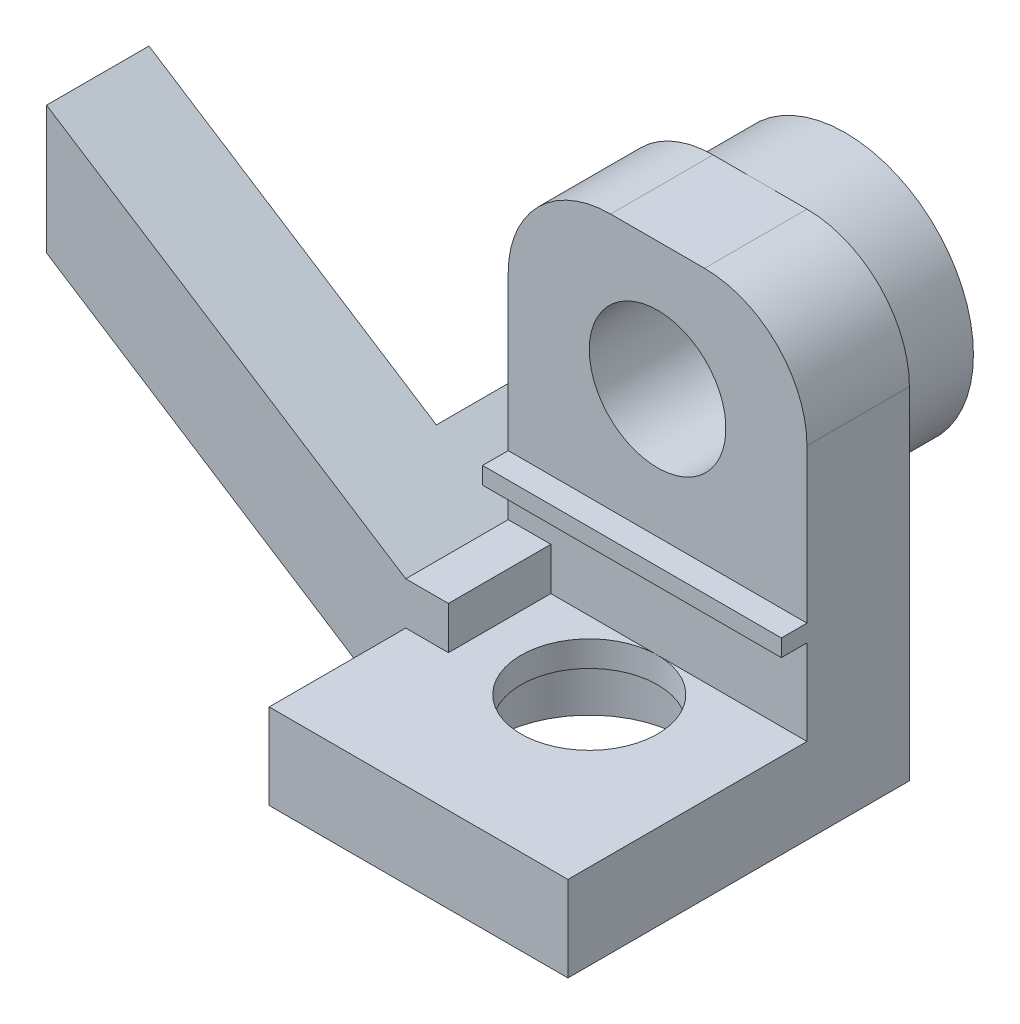
ISO-10303-21;
HEADER;
FILE_DESCRIPTION(('STEP AP214'),'2;1');
FILE_NAME('part.step','',(''),(''),'','','');
FILE_SCHEMA(('AUTOMOTIVE_DESIGN { 1 0 10303 214 1 1 1 1 }'));
ENDSEC;
DATA;
#1=APPLICATION_CONTEXT('core data for automotive mechanical design processes');
#2=APPLICATION_PROTOCOL_DEFINITION('international standard','automotive_design',2000,#1);
#3=PRODUCT_CONTEXT('',#1,'mechanical');
#4=PRODUCT('Part','Part','',(#3));
#5=PRODUCT_RELATED_PRODUCT_CATEGORY('part','',(#4));
#6=PRODUCT_DEFINITION_FORMATION('','',#4);
#7=PRODUCT_DEFINITION_CONTEXT('part definition',#1,'design');
#8=PRODUCT_DEFINITION('design','',#6,#7);
#9=PRODUCT_DEFINITION_SHAPE('','',#8);
#10=(LENGTH_UNIT() NAMED_UNIT(*) SI_UNIT(.MILLI.,.METRE.));
#11=(NAMED_UNIT(*) PLANE_ANGLE_UNIT() SI_UNIT($,.RADIAN.));
#12=(NAMED_UNIT(*) SI_UNIT($,.STERADIAN.) SOLID_ANGLE_UNIT());
#13=UNCERTAINTY_MEASURE_WITH_UNIT(LENGTH_MEASURE(1.E-05),#10,'distance_accuracy_value','');
#14=(GEOMETRIC_REPRESENTATION_CONTEXT(3) GLOBAL_UNCERTAINTY_ASSIGNED_CONTEXT((#13)) GLOBAL_UNIT_ASSIGNED_CONTEXT((#10,
#11,#12)) REPRESENTATION_CONTEXT('',''));
#15=CARTESIAN_POINT('',(0.,0.,0.));
#16=DIRECTION('',(0.,0.,1.));
#17=DIRECTION('',(1.,0.,0.));
#18=AXIS2_PLACEMENT_3D('',#15,#16,#17);
#19=CARTESIAN_POINT('',(-17.5,-12.,6.));
#20=DIRECTION('',(0.,0.,-1.));
#21=DIRECTION('',(-1.,0.,0.));
#22=AXIS2_PLACEMENT_3D('',#19,#20,#21);
#23=PLANE('',#22);
#24=DIRECTION('',(-1.,0.,0.));
#25=VECTOR('',#24,1.);
#26=CARTESIAN_POINT('',(-12.5,-7.,6.));
#27=LINE('',#26,#25);
#28=CARTESIAN_POINT('',(-12.5,-7.,6.));
#29=VERTEX_POINT('',#28);
#30=CARTESIAN_POINT('',(-17.5,-7.,6.));
#31=VERTEX_POINT('',#30);
#32=EDGE_CURVE('E206',#29,#31,#27,.T.);
#33=ORIENTED_EDGE('',*,*,#32,.F.);
#34=DIRECTION('',(0.,1.,0.));
#35=VECTOR('',#34,1.);
#36=CARTESIAN_POINT('',(-12.5,-7.,6.));
#37=LINE('',#36,#35);
#38=CARTESIAN_POINT('',(-12.5,-12.,6.));
#39=VERTEX_POINT('',#38);
#40=EDGE_CURVE('E213',#39,#29,#37,.T.);
#41=ORIENTED_EDGE('',*,*,#40,.F.);
#42=DIRECTION('',(-1.,0.,0.));
#43=VECTOR('',#42,1.);
#44=CARTESIAN_POINT('',(-17.5,-12.,6.));
#45=LINE('',#44,#43);
#46=CARTESIAN_POINT('',(0.,-12.,6.));
#47=VERTEX_POINT('',#46);
#48=EDGE_CURVE('E211',#47,#39,#45,.T.);
#49=ORIENTED_EDGE('',*,*,#48,.F.);
#50=CARTESIAN_POINT('',(17.5,-12.,6.));
#51=VERTEX_POINT('',#50);
#52=EDGE_CURVE('E331',#51,#47,#45,.T.);
#53=ORIENTED_EDGE('',*,*,#52,.F.);
#54=DIRECTION('',(0.,1.,0.));
#55=VECTOR('',#54,1.);
#56=CARTESIAN_POINT('',(17.5,-12.,6.));
#57=LINE('',#56,#55);
#58=CARTESIAN_POINT('',(17.5,-2.,6.));
#59=VERTEX_POINT('',#58);
#60=EDGE_CURVE('E340',#51,#59,#57,.T.);
#61=ORIENTED_EDGE('',*,*,#60,.T.);
#62=DIRECTION('',(-1.,0.,0.));
#63=VECTOR('',#62,1.);
#64=CARTESIAN_POINT('',(-17.5,-2.,6.));
#65=LINE('',#64,#63);
#66=CARTESIAN_POINT('',(-17.5,-2.,6.));
#67=VERTEX_POINT('',#66);
#68=EDGE_CURVE('E61',#59,#67,#65,.T.);
#69=ORIENTED_EDGE('',*,*,#68,.T.);
#70=DIRECTION('',(0.,1.,0.));
#71=VECTOR('',#70,1.);
#72=CARTESIAN_POINT('',(-17.5,-12.,6.));
#73=LINE('',#72,#71);
#74=EDGE_CURVE('E335',#31,#67,#73,.T.);
#75=ORIENTED_EDGE('',*,*,#74,.F.);
#76=EDGE_LOOP('',(#33,#41,#49,#53,#61,#69,#75));
#77=FACE_BOUND('',#76,.T.);
#78=ADVANCED_FACE('F39',(#77),#23,.F.);
#79=CARTESIAN_POINT('',(0.,-12.,0.));
#80=DIRECTION('',(0.,1.,0.));
#81=DIRECTION('',(0.,0.,1.));
#82=AXIS2_PLACEMENT_3D('',#79,#80,#81);
#83=PLANE('',#82);
#84=DIRECTION('',(0.,0.,-1.));
#85=VECTOR('',#84,1.);
#86=CARTESIAN_POINT('',(-12.5,-12.,18.));
#87=LINE('',#86,#85);
#88=CARTESIAN_POINT('',(-12.5,-12.,18.));
#89=VERTEX_POINT('',#88);
#90=EDGE_CURVE('E187',#89,#39,#87,.T.);
#91=ORIENTED_EDGE('',*,*,#90,.F.);
#92=DIRECTION('',(-1.,0.,0.));
#93=VECTOR('',#92,1.);
#94=CARTESIAN_POINT('',(-12.5,-12.,18.));
#95=LINE('',#94,#93);
#96=CARTESIAN_POINT('',(-17.5,-12.,18.));
#97=VERTEX_POINT('',#96);
#98=EDGE_CURVE('E196',#89,#97,#95,.T.);
#99=ORIENTED_EDGE('',*,*,#98,.T.);
#100=DIRECTION('',(0.,0.,-1.));
#101=VECTOR('',#100,1.);
#102=CARTESIAN_POINT('',(-17.5,-12.,-6.));
#103=LINE('',#102,#101);
#104=CARTESIAN_POINT('',(-17.5,-12.,34.));
#105=VERTEX_POINT('',#104);
#106=EDGE_CURVE('E297',#105,#97,#103,.T.);
#107=ORIENTED_EDGE('',*,*,#106,.F.);
#108=DIRECTION('',(-1.,0.,0.));
#109=VECTOR('',#108,1.);
#110=CARTESIAN_POINT('',(-17.5,-12.,34.));
#111=LINE('',#110,#109);
#112=CARTESIAN_POINT('',(17.5,-12.,34.));
#113=VERTEX_POINT('',#112);
#114=EDGE_CURVE('E306',#113,#105,#111,.T.);
#115=ORIENTED_EDGE('',*,*,#114,.F.);
#116=DIRECTION('',(0.,0.,1.));
#117=VECTOR('',#116,1.);
#118=CARTESIAN_POINT('',(17.5,-12.,-6.));
#119=LINE('',#118,#117);
#120=EDGE_CURVE('E319',#51,#113,#119,.T.);
#121=ORIENTED_EDGE('',*,*,#120,.F.);
#122=ORIENTED_EDGE('',*,*,#52,.T.);
#123=CARTESIAN_POINT('',(0.,-12.,14.));
#124=DIRECTION('',(0.,-1.,0.));
#125=DIRECTION('',(0.,0.,-1.));
#126=AXIS2_PLACEMENT_3D('',#123,#124,#125);
#127=CIRCLE('',#126,8.);
#128=EDGE_CURVE('E54',#47,#47,#127,.T.);
#129=ORIENTED_EDGE('',*,*,#128,.T.);
#130=ORIENTED_EDGE('',*,*,#48,.T.);
#131=EDGE_LOOP('',(#91,#99,#107,#115,#121,#122,#129,#130));
#132=FACE_BOUND('',#131,.T.);
#133=ADVANCED_FACE('F209',(#132),#83,.T.);
#134=CARTESIAN_POINT('',(-17.5,20.,-6.));
#135=DIRECTION('',(1.,0.,0.));
#136=DIRECTION('',(0.,0.,-1.));
#137=AXIS2_PLACEMENT_3D('',#134,#135,#136);
#138=PLANE('',#137);
#139=DIRECTION('',(0.,1.,0.));
#140=VECTOR('',#139,1.);
#141=CARTESIAN_POINT('',(-17.5,-22.,18.));
#142=LINE('',#141,#140);
#143=CARTESIAN_POINT('',(-17.5,-22.,18.));
#144=VERTEX_POINT('',#143);
#145=EDGE_CURVE('E200',#144,#97,#142,.T.);
#146=ORIENTED_EDGE('',*,*,#145,.F.);
#147=DIRECTION('',(0.,0.,-1.));
#148=VECTOR('',#147,1.);
#149=CARTESIAN_POINT('',(-17.5,-22.,-6.));
#150=LINE('',#149,#148);
#151=CARTESIAN_POINT('',(-17.5,-22.,34.));
#152=VERTEX_POINT('',#151);
#153=EDGE_CURVE('E301',#152,#144,#150,.T.);
#154=ORIENTED_EDGE('',*,*,#153,.F.);
#155=DIRECTION('',(0.,1.,0.));
#156=VECTOR('',#155,1.);
#157=CARTESIAN_POINT('',(-17.5,-22.,34.));
#158=LINE('',#157,#156);
#159=EDGE_CURVE('E316',#152,#105,#158,.T.);
#160=ORIENTED_EDGE('',*,*,#159,.T.);
#161=ORIENTED_EDGE('',*,*,#106,.T.);
#162=EDGE_LOOP('',(#146,#154,#160,#161));
#163=FACE_BOUND('',#162,.T.);
#164=ADVANCED_FACE('F487',(#163),#138,.F.);
#165=DIRECTION('',(0.,-1.,0.));
#166=VECTOR('',#165,1.);
#167=CARTESIAN_POINT('',(-17.5,20.,-6.));
#168=LINE('',#167,#166);
#169=CARTESIAN_POINT('',(-17.5,18.,-6.));
#170=VERTEX_POINT('',#169);
#171=CARTESIAN_POINT('',(-17.5,-7.,-6.));
#172=VERTEX_POINT('',#171);
#173=EDGE_CURVE('E412',#170,#172,#168,.T.);
#174=ORIENTED_EDGE('',*,*,#173,.T.);
#175=DIRECTION('',(0.,0.,-1.));
#176=VECTOR('',#175,1.);
#177=CARTESIAN_POINT('',(-17.5,-7.,6.));
#178=LINE('',#177,#176);
#179=EDGE_CURVE('E279',#31,#172,#178,.T.);
#180=ORIENTED_EDGE('',*,*,#179,.F.);
#181=ORIENTED_EDGE('',*,*,#74,.T.);
#182=DIRECTION('',(0.,0.,-1.));
#183=VECTOR('',#182,1.);
#184=CARTESIAN_POINT('',(-17.5,-2.,-6.));
#185=LINE('',#184,#183);
#186=CARTESIAN_POINT('',(-17.5,-2.,9.));
#187=VERTEX_POINT('',#186);
#188=EDGE_CURVE('E345',#187,#67,#185,.T.);
#189=ORIENTED_EDGE('',*,*,#188,.F.);
#190=DIRECTION('',(0.,1.,0.));
#191=VECTOR('',#190,1.);
#192=CARTESIAN_POINT('',(-17.5,-2.,9.));
#193=LINE('',#192,#191);
#194=CARTESIAN_POINT('',(-17.5,0.,9.));
#195=VERTEX_POINT('',#194);
#196=EDGE_CURVE('E355',#187,#195,#193,.T.);
#197=ORIENTED_EDGE('',*,*,#196,.T.);
#198=DIRECTION('',(0.,0.,-1.));
#199=VECTOR('',#198,1.);
#200=CARTESIAN_POINT('',(-17.5,0.,-6.));
#201=LINE('',#200,#199);
#202=CARTESIAN_POINT('',(-17.5,0.,6.));
#203=VERTEX_POINT('',#202);
#204=EDGE_CURVE('E344',#195,#203,#201,.T.);
#205=ORIENTED_EDGE('',*,*,#204,.T.);
#206=DIRECTION('',(0.,-1.,0.));
#207=VECTOR('',#206,1.);
#208=CARTESIAN_POINT('',(-17.5,20.,6.));
#209=LINE('',#208,#207);
#210=CARTESIAN_POINT('',(-17.5,18.,6.));
#211=VERTEX_POINT('',#210);
#212=EDGE_CURVE('E408',#211,#203,#209,.T.);
#213=ORIENTED_EDGE('',*,*,#212,.F.);
#214=DIRECTION('',(0.,0.,1.));
#215=VECTOR('',#214,1.);
#216=CARTESIAN_POINT('',(-17.5,18.,-6.));
#217=LINE('',#216,#215);
#218=EDGE_CURVE('E433',#211,#170,#217,.F.);
#219=ORIENTED_EDGE('',*,*,#218,.T.);
#220=EDGE_LOOP('',(#174,#180,#181,#189,#197,#205,#213,#219));
#221=FACE_BOUND('',#220,.T.);
#222=ADVANCED_FACE('F497',(#221),#138,.F.);
#223=CARTESIAN_POINT('',(0.,-2.,0.));
#224=DIRECTION('',(0.,1.,0.));
#225=DIRECTION('',(0.,0.,1.));
#226=AXIS2_PLACEMENT_3D('',#223,#224,#225);
#227=PLANE('',#226);
#228=ORIENTED_EDGE('',*,*,#68,.F.);
#229=DIRECTION('',(0.,0.,1.));
#230=VECTOR('',#229,1.);
#231=CARTESIAN_POINT('',(17.5,-2.,-6.));
#232=LINE('',#231,#230);
#233=CARTESIAN_POINT('',(17.5,-2.,9.));
#234=VERTEX_POINT('',#233);
#235=EDGE_CURVE('E348',#59,#234,#232,.T.);
#236=ORIENTED_EDGE('',*,*,#235,.T.);
#237=DIRECTION('',(-1.,0.,0.));
#238=VECTOR('',#237,1.);
#239=CARTESIAN_POINT('',(-17.5,-2.,9.));
#240=LINE('',#239,#238);
#241=EDGE_CURVE('E352',#234,#187,#240,.T.);
#242=ORIENTED_EDGE('',*,*,#241,.T.);
#243=ORIENTED_EDGE('',*,*,#188,.T.);
#244=EDGE_LOOP('',(#228,#236,#242,#243));
#245=FACE_BOUND('',#244,.T.);
#246=ADVANCED_FACE('F493',(#245),#227,.F.);
#247=CARTESIAN_POINT('',(-17.5,20.,-6.));
#248=DIRECTION('',(0.,0.,1.));
#249=DIRECTION('',(1.,0.,0.));
#250=AXIS2_PLACEMENT_3D('',#247,#248,#249);
#251=PLANE('',#250);
#252=CARTESIAN_POINT('',(0.,15.,-6.));
#253=DIRECTION('',(0.,0.,-1.));
#254=DIRECTION('',(-1.,0.,0.));
#255=AXIS2_PLACEMENT_3D('',#252,#253,#254);
#256=CIRCLE('',#255,8.);
#257=CARTESIAN_POINT('',(-8.00000000000001,15.,-6.));
#258=VERTEX_POINT('',#257);
#259=EDGE_CURVE('E382',#258,#258,#256,.T.);
#260=ORIENTED_EDGE('',*,*,#259,.F.);
#261=EDGE_LOOP('',(#260));
#262=FACE_BOUND('',#261,.T.);
#263=CARTESIAN_POINT('',(0.,15.,-6.));
#264=DIRECTION('',(0.,0.,-1.));
#265=DIRECTION('',(-1.,0.,0.));
#266=AXIS2_PLACEMENT_3D('',#263,#264,#265);
#267=CIRCLE('',#266,12.);
#268=CARTESIAN_POINT('',(-12.,15.,-6.));
#269=VERTEX_POINT('',#268);
#270=EDGE_CURVE('E371',#269,#269,#267,.T.);
#271=ORIENTED_EDGE('',*,*,#270,.T.);
#272=EDGE_LOOP('',(#271));
#273=FACE_BOUND('',#272,.T.);
#274=ADVANCED_FACE('F496',(#262,#273),#251,.F.);
#275=CARTESIAN_POINT('',(17.5,20.,-6.));
#276=DIRECTION('',(-1.,0.,0.));
#277=DIRECTION('',(0.,0.,1.));
#278=AXIS2_PLACEMENT_3D('',#275,#276,#277);
#279=PLANE('',#278);
#280=DIRECTION('',(0.,-1.,0.));
#281=VECTOR('',#280,1.);
#282=CARTESIAN_POINT('',(17.5,20.,-6.));
#283=LINE('',#282,#281);
#284=CARTESIAN_POINT('',(17.5,18.,-6.));
#285=VERTEX_POINT('',#284);
#286=CARTESIAN_POINT('',(17.5,-22.,-6.));
#287=VERTEX_POINT('',#286);
#288=EDGE_CURVE('E416',#285,#287,#283,.T.);
#289=ORIENTED_EDGE('',*,*,#288,.F.);
#290=DIRECTION('',(0.,0.,-1.));
#291=VECTOR('',#290,1.);
#292=CARTESIAN_POINT('',(17.5,18.,6.));
#293=LINE('',#292,#291);
#294=CARTESIAN_POINT('',(17.5,18.,6.));
#295=VERTEX_POINT('',#294);
#296=EDGE_CURVE('E43',#285,#295,#293,.F.);
#297=ORIENTED_EDGE('',*,*,#296,.T.);
#298=DIRECTION('',(0.,-1.,0.));
#299=VECTOR('',#298,1.);
#300=CARTESIAN_POINT('',(17.5,20.,6.));
#301=LINE('',#300,#299);
#302=CARTESIAN_POINT('',(17.5,0.,6.));
#303=VERTEX_POINT('',#302);
#304=EDGE_CURVE('E404',#295,#303,#301,.T.);
#305=ORIENTED_EDGE('',*,*,#304,.T.);
#306=DIRECTION('',(0.,0.,1.));
#307=VECTOR('',#306,1.);
#308=CARTESIAN_POINT('',(17.5,0.,-6.));
#309=LINE('',#308,#307);
#310=CARTESIAN_POINT('',(17.5,0.,9.));
#311=VERTEX_POINT('',#310);
#312=EDGE_CURVE('E359',#303,#311,#309,.T.);
#313=ORIENTED_EDGE('',*,*,#312,.T.);
#314=DIRECTION('',(0.,1.,0.));
#315=VECTOR('',#314,1.);
#316=CARTESIAN_POINT('',(17.5,-2.,9.));
#317=LINE('',#316,#315);
#318=EDGE_CURVE('E367',#234,#311,#317,.T.);
#319=ORIENTED_EDGE('',*,*,#318,.F.);
#320=ORIENTED_EDGE('',*,*,#235,.F.);
#321=ORIENTED_EDGE('',*,*,#60,.F.);
#322=ORIENTED_EDGE('',*,*,#120,.T.);
#323=DIRECTION('',(0.,1.,0.));
#324=VECTOR('',#323,1.);
#325=CARTESIAN_POINT('',(17.5,-22.,34.));
#326=LINE('',#325,#324);
#327=CARTESIAN_POINT('',(17.5,-22.,34.));
#328=VERTEX_POINT('',#327);
#329=EDGE_CURVE('E327',#328,#113,#326,.T.);
#330=ORIENTED_EDGE('',*,*,#329,.F.);
#331=DIRECTION('',(0.,0.,1.));
#332=VECTOR('',#331,1.);
#333=CARTESIAN_POINT('',(17.5,-22.,-6.));
#334=LINE('',#333,#332);
#335=EDGE_CURVE('E310',#287,#328,#334,.T.);
#336=ORIENTED_EDGE('',*,*,#335,.F.);
#337=EDGE_LOOP('',(#289,#297,#305,#313,#319,#320,#321,#322,#330,#336));
#338=FACE_BOUND('',#337,.T.);
#339=ADVANCED_FACE('F451',(#338),#279,.F.);
#340=CARTESIAN_POINT('',(0.,15.,-6.));
#341=DIRECTION('',(0.,0.,-1.));
#342=DIRECTION('',(-1.,0.,0.));
#343=AXIS2_PLACEMENT_3D('',#340,#341,#342);
#344=CIRCLE('',#343,15.);
#345=CARTESIAN_POINT('',(0.,30.,-6.));
#346=VERTEX_POINT('',#345);
#347=EDGE_CURVE('E11',#346,#346,#344,.T.);
#348=ORIENTED_EDGE('',*,*,#347,.F.);
#349=DIRECTION('',(-1.,0.,0.));
#350=VECTOR('',#349,1.);
#351=CARTESIAN_POINT('',(-17.5,30.,-6.));
#352=LINE('',#351,#350);
#353=CARTESIAN_POINT('',(5.49999999999999,30.,-6.));
#354=VERTEX_POINT('',#353);
#355=EDGE_CURVE('E396',#354,#346,#352,.T.);
#356=ORIENTED_EDGE('',*,*,#355,.F.);
#357=CARTESIAN_POINT('',(5.49999999999999,18.,-6.));
#358=DIRECTION('',(0.,0.,1.));
#359=DIRECTION('',(1.,0.,0.));
#360=AXIS2_PLACEMENT_3D('',#357,#358,#359);
#361=CIRCLE('',#360,12.);
#362=EDGE_CURVE('E436',#354,#285,#361,.F.);
#363=ORIENTED_EDGE('',*,*,#362,.T.);
#364=ORIENTED_EDGE('',*,*,#288,.T.);
#365=DIRECTION('',(1.,0.,0.));
#366=VECTOR('',#365,1.);
#367=CARTESIAN_POINT('',(-17.5,-22.,-6.));
#368=LINE('',#367,#366);
#369=CARTESIAN_POINT('',(-17.5,-22.,-6.));
#370=VERTEX_POINT('',#369);
#371=EDGE_CURVE('E305',#370,#287,#368,.T.);
#372=ORIENTED_EDGE('',*,*,#371,.F.);
#373=DIRECTION('',(-0.841510781945305,0.540240320477657,0.));
#374=VECTOR('',#373,1.);
#375=CARTESIAN_POINT('',(-25.9151078194531,-16.5975967952234,-6.));
#376=LINE('',#375,#374);
#377=CARTESIAN_POINT('',(-25.9151078194531,-16.5975967952234,-6.));
#378=VERTEX_POINT('',#377);
#379=EDGE_CURVE('E257',#370,#378,#376,.T.);
#380=ORIENTED_EDGE('',*,*,#379,.T.);
#381=DIRECTION('',(0.,1.,0.));
#382=VECTOR('',#381,1.);
#383=CARTESIAN_POINT('',(-25.9151078194531,-1.59759679522343,-6.));
#384=LINE('',#383,#382);
#385=CARTESIAN_POINT('',(-25.9151078194531,-1.59759679522343,-6.));
#386=VERTEX_POINT('',#385);
#387=EDGE_CURVE('E267',#378,#386,#384,.T.);
#388=ORIENTED_EDGE('',*,*,#387,.T.);
#389=DIRECTION('',(0.841510781945305,-0.540240320477657,0.));
#390=VECTOR('',#389,1.);
#391=CARTESIAN_POINT('',(-17.5,-7.,-6.));
#392=LINE('',#391,#390);
#393=EDGE_CURVE('E263',#386,#172,#392,.T.);
#394=ORIENTED_EDGE('',*,*,#393,.T.);
#395=ORIENTED_EDGE('',*,*,#173,.F.);
#396=CARTESIAN_POINT('',(-5.50000000000001,18.,-6.));
#397=DIRECTION('',(0.,0.,1.));
#398=DIRECTION('',(1.,0.,0.));
#399=AXIS2_PLACEMENT_3D('',#396,#397,#398);
#400=CIRCLE('',#399,12.);
#401=CARTESIAN_POINT('',(-5.50000000000001,30.,-6.));
#402=VERTEX_POINT('',#401);
#403=EDGE_CURVE('E438',#170,#402,#400,.F.);
#404=ORIENTED_EDGE('',*,*,#403,.T.);
#405=EDGE_CURVE('E395',#346,#402,#352,.T.);
#406=ORIENTED_EDGE('',*,*,#405,.F.);
#407=EDGE_LOOP('',(#348,#356,#363,#364,#372,#380,#388,#394,#395,#404,#406));
#408=FACE_BOUND('',#407,.T.);
#409=ADVANCED_FACE('F462',(#408),#251,.F.);
#410=CARTESIAN_POINT('',(-17.5,20.,6.));
#411=DIRECTION('',(0.,0.,-1.));
#412=DIRECTION('',(-1.,0.,0.));
#413=AXIS2_PLACEMENT_3D('',#410,#411,#412);
#414=PLANE('',#413);
#415=CARTESIAN_POINT('',(0.,15.,6.));
#416=DIRECTION('',(0.,0.,-1.));
#417=DIRECTION('',(-1.,0.,0.));
#418=AXIS2_PLACEMENT_3D('',#415,#416,#417);
#419=CIRCLE('',#418,8.);
#420=CARTESIAN_POINT('',(-8.00000000000001,15.,6.));
#421=VERTEX_POINT('',#420);
#422=EDGE_CURVE('E384',#421,#421,#419,.T.);
#423=ORIENTED_EDGE('',*,*,#422,.T.);
#424=EDGE_LOOP('',(#423));
#425=FACE_BOUND('',#424,.T.);
#426=DIRECTION('',(1.,0.,0.));
#427=VECTOR('',#426,1.);
#428=CARTESIAN_POINT('',(-17.5,30.,6.));
#429=LINE('',#428,#427);
#430=CARTESIAN_POINT('',(-5.5,30.,6.));
#431=VERTEX_POINT('',#430);
#432=CARTESIAN_POINT('',(5.49999999999999,30.,6.));
#433=VERTEX_POINT('',#432);
#434=EDGE_CURVE('E388',#431,#433,#429,.T.);
#435=ORIENTED_EDGE('',*,*,#434,.F.);
#436=CARTESIAN_POINT('',(-5.5,18.,6.));
#437=DIRECTION('',(0.,0.,-1.));
#438=DIRECTION('',(-1.,0.,0.));
#439=AXIS2_PLACEMENT_3D('',#436,#437,#438);
#440=CIRCLE('',#439,12.);
#441=EDGE_CURVE('E430',#431,#211,#440,.F.);
#442=ORIENTED_EDGE('',*,*,#441,.T.);
#443=ORIENTED_EDGE('',*,*,#212,.T.);
#444=DIRECTION('',(1.,0.,0.));
#445=VECTOR('',#444,1.);
#446=CARTESIAN_POINT('',(-17.5,0.,6.));
#447=LINE('',#446,#445);
#448=EDGE_CURVE('E400',#203,#303,#447,.T.);
#449=ORIENTED_EDGE('',*,*,#448,.T.);
#450=ORIENTED_EDGE('',*,*,#304,.F.);
#451=CARTESIAN_POINT('',(5.49999999999999,18.,6.));
#452=DIRECTION('',(0.,0.,-1.));
#453=DIRECTION('',(-1.,0.,0.));
#454=AXIS2_PLACEMENT_3D('',#451,#452,#453);
#455=CIRCLE('',#454,12.);
#456=EDGE_CURVE('E427',#295,#433,#455,.F.);
#457=ORIENTED_EDGE('',*,*,#456,.T.);
#458=EDGE_LOOP('',(#435,#442,#443,#449,#450,#457));
#459=FACE_BOUND('',#458,.T.);
#460=ADVANCED_FACE('F457',(#425,#459),#414,.F.);
#461=CARTESIAN_POINT('',(0.,30.,0.));
#462=DIRECTION('',(0.,1.,0.));
#463=DIRECTION('',(0.,0.,1.));
#464=AXIS2_PLACEMENT_3D('',#461,#462,#463);
#465=PLANE('',#464);
#466=ORIENTED_EDGE('',*,*,#355,.T.);
#467=ORIENTED_EDGE('',*,*,#405,.T.);
#468=DIRECTION('',(0.,0.,1.));
#469=VECTOR('',#468,1.);
#470=CARTESIAN_POINT('',(-5.5,30.,5.99999999999999));
#471=LINE('',#470,#469);
#472=EDGE_CURVE('E423',#402,#431,#471,.T.);
#473=ORIENTED_EDGE('',*,*,#472,.T.);
#474=ORIENTED_EDGE('',*,*,#434,.T.);
#475=DIRECTION('',(0.,0.,-1.));
#476=VECTOR('',#475,1.);
#477=CARTESIAN_POINT('',(5.49999999999999,30.,-6.));
#478=LINE('',#477,#476);
#479=EDGE_CURVE('E419',#433,#354,#478,.T.);
#480=ORIENTED_EDGE('',*,*,#479,.T.);
#481=EDGE_LOOP('',(#466,#467,#473,#474,#480));
#482=FACE_BOUND('',#481,.T.);
#483=ADVANCED_FACE('F461',(#482),#465,.T.);
#484=CARTESIAN_POINT('',(0.,15.,6.));
#485=DIRECTION('',(0.,0.,-1.));
#486=DIRECTION('',(-1.,0.,0.));
#487=AXIS2_PLACEMENT_3D('',#484,#485,#486);
#488=CYLINDRICAL_SURFACE('',#487,8.);
#489=ORIENTED_EDGE('',*,*,#422,.F.);
#490=EDGE_LOOP('',(#489));
#491=FACE_BOUND('',#490,.T.);
#492=ORIENTED_EDGE('',*,*,#259,.T.);
#493=EDGE_LOOP('',(#492));
#494=FACE_BOUND('',#493,.T.);
#495=ADVANCED_FACE('F547',(#491,#494),#488,.F.);
#496=CARTESIAN_POINT('',(-5.5,18.,0.));
#497=DIRECTION('',(0.,0.,-1.));
#498=DIRECTION('',(-1.,0.,0.));
#499=AXIS2_PLACEMENT_3D('',#496,#497,#498);
#500=CYLINDRICAL_SURFACE('',#499,12.);
#501=ORIENTED_EDGE('',*,*,#403,.F.);
#502=ORIENTED_EDGE('',*,*,#218,.F.);
#503=ORIENTED_EDGE('',*,*,#441,.F.);
#504=ORIENTED_EDGE('',*,*,#472,.F.);
#505=EDGE_LOOP('',(#501,#502,#503,#504));
#506=FACE_BOUND('',#505,.T.);
#507=ADVANCED_FACE('F543',(#506),#500,.T.);
#508=CARTESIAN_POINT('',(5.49999999999999,18.,0.));
#509=DIRECTION('',(0.,0.,1.));
#510=DIRECTION('',(1.,0.,0.));
#511=AXIS2_PLACEMENT_3D('',#508,#509,#510);
#512=CYLINDRICAL_SURFACE('',#511,12.);
#513=ORIENTED_EDGE('',*,*,#456,.F.);
#514=ORIENTED_EDGE('',*,*,#296,.F.);
#515=ORIENTED_EDGE('',*,*,#362,.F.);
#516=ORIENTED_EDGE('',*,*,#479,.F.);
#517=EDGE_LOOP('',(#513,#514,#515,#516));
#518=FACE_BOUND('',#517,.T.);
#519=ADVANCED_FACE('F41',(#518),#512,.T.);
#520=CARTESIAN_POINT('',(0.,15.,-16.));
#521=DIRECTION('',(0.,0.,-1.));
#522=DIRECTION('',(-1.,0.,0.));
#523=AXIS2_PLACEMENT_3D('',#520,#521,#522);
#524=PLANE('',#523);
#525=CARTESIAN_POINT('',(0.,15.,-16.));
#526=DIRECTION('',(0.,0.,-1.));
#527=DIRECTION('',(-1.,0.,0.));
#528=AXIS2_PLACEMENT_3D('',#525,#526,#527);
#529=CIRCLE('',#528,15.);
#530=CARTESIAN_POINT('',(-15.,15.,-16.));
#531=VERTEX_POINT('',#530);
#532=EDGE_CURVE('E376',#531,#531,#529,.T.);
#533=ORIENTED_EDGE('',*,*,#532,.T.);
#534=EDGE_LOOP('',(#533));
#535=FACE_BOUND('',#534,.T.);
#536=CARTESIAN_POINT('',(0.,15.,-16.));
#537=DIRECTION('',(0.,0.,-1.));
#538=DIRECTION('',(-1.,0.,0.));
#539=AXIS2_PLACEMENT_3D('',#536,#537,#538);
#540=CIRCLE('',#539,12.);
#541=CARTESIAN_POINT('',(-12.,15.,-16.));
#542=VERTEX_POINT('',#541);
#543=EDGE_CURVE('E372',#542,#542,#540,.T.);
#544=ORIENTED_EDGE('',*,*,#543,.F.);
#545=EDGE_LOOP('',(#544));
#546=FACE_BOUND('',#545,.T.);
#547=ADVANCED_FACE('F467',(#535,#546),#524,.T.);
#548=CARTESIAN_POINT('',(0.,15.,-16.));
#549=DIRECTION('',(0.,0.,1.));
#550=DIRECTION('',(1.,0.,0.));
#551=AXIS2_PLACEMENT_3D('',#548,#549,#550);
#552=CYLINDRICAL_SURFACE('',#551,15.);
#553=ORIENTED_EDGE('',*,*,#532,.F.);
#554=EDGE_LOOP('',(#553));
#555=FACE_BOUND('',#554,.T.);
#556=ORIENTED_EDGE('',*,*,#347,.T.);
#557=EDGE_LOOP('',(#556));
#558=FACE_BOUND('',#557,.T.);
#559=ADVANCED_FACE('F464',(#555,#558),#552,.T.);
#560=CARTESIAN_POINT('',(0.,15.,-16.));
#561=DIRECTION('',(0.,0.,1.));
#562=DIRECTION('',(1.,0.,0.));
#563=AXIS2_PLACEMENT_3D('',#560,#561,#562);
#564=CYLINDRICAL_SURFACE('',#563,12.);
#565=ORIENTED_EDGE('',*,*,#543,.T.);
#566=EDGE_LOOP('',(#565));
#567=FACE_BOUND('',#566,.T.);
#568=ORIENTED_EDGE('',*,*,#270,.F.);
#569=EDGE_LOOP('',(#568));
#570=FACE_BOUND('',#569,.T.);
#571=ADVANCED_FACE('F466',(#567,#570),#564,.F.);
#572=CARTESIAN_POINT('',(0.,0.,0.));
#573=DIRECTION('',(0.,1.,0.));
#574=DIRECTION('',(0.,0.,1.));
#575=AXIS2_PLACEMENT_3D('',#572,#573,#574);
#576=PLANE('',#575);
#577=ORIENTED_EDGE('',*,*,#448,.F.);
#578=ORIENTED_EDGE('',*,*,#204,.F.);
#579=DIRECTION('',(-1.,0.,0.));
#580=VECTOR('',#579,1.);
#581=CARTESIAN_POINT('',(-17.5,0.,9.));
#582=LINE('',#581,#580);
#583=EDGE_CURVE('E349',#311,#195,#582,.T.);
#584=ORIENTED_EDGE('',*,*,#583,.F.);
#585=ORIENTED_EDGE('',*,*,#312,.F.);
#586=EDGE_LOOP('',(#577,#578,#584,#585));
#587=FACE_BOUND('',#586,.T.);
#588=ADVANCED_FACE('F474',(#587),#576,.T.);
#589=CARTESIAN_POINT('',(-17.5,-2.,9.));
#590=DIRECTION('',(0.,0.,-1.));
#591=DIRECTION('',(-1.,0.,0.));
#592=AXIS2_PLACEMENT_3D('',#589,#590,#591);
#593=PLANE('',#592);
#594=ORIENTED_EDGE('',*,*,#583,.T.);
#595=ORIENTED_EDGE('',*,*,#196,.F.);
#596=ORIENTED_EDGE('',*,*,#241,.F.);
#597=ORIENTED_EDGE('',*,*,#318,.T.);
#598=EDGE_LOOP('',(#594,#595,#596,#597));
#599=FACE_BOUND('',#598,.T.);
#600=ADVANCED_FACE('F500',(#599),#593,.F.);
#601=CARTESIAN_POINT('',(-17.5,-22.,34.));
#602=DIRECTION('',(0.,0.,-1.));
#603=DIRECTION('',(-1.,0.,0.));
#604=AXIS2_PLACEMENT_3D('',#601,#602,#603);
#605=PLANE('',#604);
#606=ORIENTED_EDGE('',*,*,#114,.T.);
#607=ORIENTED_EDGE('',*,*,#159,.F.);
#608=DIRECTION('',(-1.,0.,0.));
#609=VECTOR('',#608,1.);
#610=CARTESIAN_POINT('',(-17.5,-22.,34.));
#611=LINE('',#610,#609);
#612=EDGE_CURVE('E313',#328,#152,#611,.T.);
#613=ORIENTED_EDGE('',*,*,#612,.F.);
#614=ORIENTED_EDGE('',*,*,#329,.T.);
#615=EDGE_LOOP('',(#606,#607,#613,#614));
#616=FACE_BOUND('',#615,.T.);
#617=ADVANCED_FACE('F492',(#616),#605,.F.);
#618=CARTESIAN_POINT('',(0.,-22.,0.));
#619=DIRECTION('',(0.,1.,0.));
#620=DIRECTION('',(0.,0.,1.));
#621=AXIS2_PLACEMENT_3D('',#618,#619,#620);
#622=PLANE('',#621);
#623=CARTESIAN_POINT('',(0.,-22.,14.));
#624=DIRECTION('',(0.,-1.,0.));
#625=DIRECTION('',(0.,0.,-1.));
#626=AXIS2_PLACEMENT_3D('',#623,#624,#625);
#627=CIRCLE('',#626,11.2);
#628=CARTESIAN_POINT('',(0.,-22.,2.8));
#629=VERTEX_POINT('',#628);
#630=EDGE_CURVE('E289',#629,#629,#627,.T.);
#631=ORIENTED_EDGE('',*,*,#630,.F.);
#632=EDGE_LOOP('',(#631));
#633=FACE_BOUND('',#632,.T.);
#634=ORIENTED_EDGE('',*,*,#153,.T.);
#635=DIRECTION('',(0.,0.,-1.));
#636=VECTOR('',#635,1.);
#637=CARTESIAN_POINT('',(-17.5,-22.,6.));
#638=LINE('',#637,#636);
#639=EDGE_CURVE('E274',#144,#370,#638,.T.);
#640=ORIENTED_EDGE('',*,*,#639,.T.);
#641=ORIENTED_EDGE('',*,*,#371,.T.);
#642=ORIENTED_EDGE('',*,*,#335,.T.);
#643=ORIENTED_EDGE('',*,*,#612,.T.);
#644=EDGE_LOOP('',(#634,#640,#641,#642,#643));
#645=FACE_BOUND('',#644,.T.);
#646=ADVANCED_FACE('F507',(#633,#645),#622,.F.);
#647=CARTESIAN_POINT('',(0.,-15.,14.));
#648=DIRECTION('',(0.,-1.,0.));
#649=DIRECTION('',(0.,0.,-1.));
#650=AXIS2_PLACEMENT_3D('',#647,#648,#649);
#651=CYLINDRICAL_SURFACE('',#650,11.2);
#652=CARTESIAN_POINT('',(0.,-15.,14.));
#653=DIRECTION('',(0.,-1.,0.));
#654=DIRECTION('',(0.,0.,-1.));
#655=AXIS2_PLACEMENT_3D('',#652,#653,#654);
#656=CIRCLE('',#655,11.2);
#657=CARTESIAN_POINT('',(0.,-15.,2.8));
#658=VERTEX_POINT('',#657);
#659=EDGE_CURVE('E293',#658,#658,#656,.T.);
#660=ORIENTED_EDGE('',*,*,#659,.F.);
#661=EDGE_LOOP('',(#660));
#662=FACE_BOUND('',#661,.T.);
#663=ORIENTED_EDGE('',*,*,#630,.T.);
#664=EDGE_LOOP('',(#663));
#665=FACE_BOUND('',#664,.T.);
#666=ADVANCED_FACE('F625',(#662,#665),#651,.F.);
#667=CARTESIAN_POINT('',(0.,-15.,14.));
#668=DIRECTION('',(0.,-1.,0.));
#669=DIRECTION('',(0.,0.,-1.));
#670=AXIS2_PLACEMENT_3D('',#667,#668,#669);
#671=PLANE('',#670);
#672=CARTESIAN_POINT('',(0.,-15.,14.));
#673=DIRECTION('',(0.,-1.,0.));
#674=DIRECTION('',(0.,0.,-1.));
#675=AXIS2_PLACEMENT_3D('',#672,#673,#674);
#676=CIRCLE('',#675,8.);
#677=CARTESIAN_POINT('',(0.,-15.,6.));
#678=VERTEX_POINT('',#677);
#679=EDGE_CURVE('E278',#678,#678,#676,.T.);
#680=ORIENTED_EDGE('',*,*,#679,.F.);
#681=EDGE_LOOP('',(#680));
#682=FACE_BOUND('',#681,.T.);
#683=ORIENTED_EDGE('',*,*,#659,.T.);
#684=EDGE_LOOP('',(#683));
#685=FACE_BOUND('',#684,.T.);
#686=ADVANCED_FACE('F732',(#682,#685),#671,.T.);
#687=CARTESIAN_POINT('',(0.,-12.,14.));
#688=DIRECTION('',(0.,-1.,0.));
#689=DIRECTION('',(0.,0.,-1.));
#690=AXIS2_PLACEMENT_3D('',#687,#688,#689);
#691=CYLINDRICAL_SURFACE('',#690,8.);
#692=ORIENTED_EDGE('',*,*,#128,.F.);
#693=EDGE_LOOP('',(#692));
#694=FACE_BOUND('',#693,.T.);
#695=ORIENTED_EDGE('',*,*,#679,.T.);
#696=EDGE_LOOP('',(#695));
#697=FACE_BOUND('',#696,.T.);
#698=ADVANCED_FACE('F616',(#694,#697),#691,.F.);
#699=CARTESIAN_POINT('',(-25.9151078194531,-16.5975967952234,6.));
#700=DIRECTION('',(-0.540240320477657,-0.841510781945305,0.));
#701=DIRECTION('',(0.841510781945305,-0.540240320477657,0.));
#702=AXIS2_PLACEMENT_3D('',#699,#700,#701);
#703=PLANE('',#702);
#704=ORIENTED_EDGE('',*,*,#379,.F.);
#705=ORIENTED_EDGE('',*,*,#639,.F.);
#706=DIRECTION('',(0.841510781945305,-0.540240320477657,0.));
#707=VECTOR('',#706,1.);
#708=CARTESIAN_POINT('',(-17.5,-22.,18.));
#709=LINE('',#708,#707);
#710=CARTESIAN_POINT('',(-59.5755390972653,5.01201602388284,18.));
#711=VERTEX_POINT('',#710);
#712=EDGE_CURVE('E225',#711,#144,#709,.T.);
#713=ORIENTED_EDGE('',*,*,#712,.F.);
#714=DIRECTION('',(0.,0.,-1.));
#715=VECTOR('',#714,1.);
#716=CARTESIAN_POINT('',(-59.5755390972653,5.01201602388284,18.));
#717=LINE('',#716,#715);
#718=CARTESIAN_POINT('',(-59.5755390972653,5.01201602388284,6.));
#719=VERTEX_POINT('',#718);
#720=EDGE_CURVE('E237',#711,#719,#717,.T.);
#721=ORIENTED_EDGE('',*,*,#720,.T.);
#722=DIRECTION('',(0.841510781945305,-0.540240320477657,0.));
#723=VECTOR('',#722,1.);
#724=CARTESIAN_POINT('',(-17.5,-22.,6.));
#725=LINE('',#724,#723);
#726=CARTESIAN_POINT('',(-25.9151078194531,-16.5975967952234,6.));
#727=VERTEX_POINT('',#726);
#728=EDGE_CURVE('E205',#719,#727,#725,.T.);
#729=ORIENTED_EDGE('',*,*,#728,.T.);
#730=DIRECTION('',(0.,0.,-1.));
#731=VECTOR('',#730,1.);
#732=CARTESIAN_POINT('',(-25.9151078194531,-16.5975967952234,6.));
#733=LINE('',#732,#731);
#734=EDGE_CURVE('E262',#727,#378,#733,.T.);
#735=ORIENTED_EDGE('',*,*,#734,.T.);
#736=EDGE_LOOP('',(#704,#705,#713,#721,#729,#735));
#737=FACE_BOUND('',#736,.T.);
#738=ADVANCED_FACE('F530',(#737),#703,.T.);
#739=CARTESIAN_POINT('',(-17.5,-7.,6.));
#740=DIRECTION('',(0.540240320477657,0.841510781945305,0.));
#741=DIRECTION('',(-0.841510781945305,0.540240320477657,0.));
#742=AXIS2_PLACEMENT_3D('',#739,#740,#741);
#743=PLANE('',#742);
#744=ORIENTED_EDGE('',*,*,#393,.F.);
#745=DIRECTION('',(0.,0.,-1.));
#746=VECTOR('',#745,1.);
#747=CARTESIAN_POINT('',(-25.9151078194531,-1.59759679522343,6.));
#748=LINE('',#747,#746);
#749=CARTESIAN_POINT('',(-25.9151078194531,-1.59759679522343,6.));
#750=VERTEX_POINT('',#749);
#751=EDGE_CURVE('E282',#750,#386,#748,.T.);
#752=ORIENTED_EDGE('',*,*,#751,.F.);
#753=DIRECTION('',(-0.841510781945305,0.540240320477657,0.));
#754=VECTOR('',#753,1.);
#755=CARTESIAN_POINT('',(-17.5,-7.,6.));
#756=LINE('',#755,#754);
#757=CARTESIAN_POINT('',(-59.5755390972653,20.0120160238828,6.));
#758=VERTEX_POINT('',#757);
#759=EDGE_CURVE('E241',#750,#758,#756,.T.);
#760=ORIENTED_EDGE('',*,*,#759,.T.);
#761=DIRECTION('',(0.,0.,-1.));
#762=VECTOR('',#761,1.);
#763=CARTESIAN_POINT('',(-59.5755390972653,20.0120160238828,18.));
#764=LINE('',#763,#762);
#765=CARTESIAN_POINT('',(-59.5755390972653,20.0120160238828,18.));
#766=VERTEX_POINT('',#765);
#767=EDGE_CURVE('E249',#766,#758,#764,.T.);
#768=ORIENTED_EDGE('',*,*,#767,.F.);
#769=DIRECTION('',(-0.841510781945305,0.540240320477657,0.));
#770=VECTOR('',#769,1.);
#771=CARTESIAN_POINT('',(-17.5,-7.,18.));
#772=LINE('',#771,#770);
#773=CARTESIAN_POINT('',(-17.5,-7.,18.));
#774=VERTEX_POINT('',#773);
#775=EDGE_CURVE('E231',#774,#766,#772,.T.);
#776=ORIENTED_EDGE('',*,*,#775,.F.);
#777=DIRECTION('',(0.,0.,-1.));
#778=VECTOR('',#777,1.);
#779=CARTESIAN_POINT('',(-17.5,-7.,18.));
#780=LINE('',#779,#778);
#781=EDGE_CURVE('E253',#774,#31,#780,.T.);
#782=ORIENTED_EDGE('',*,*,#781,.T.);
#783=ORIENTED_EDGE('',*,*,#179,.T.);
#784=EDGE_LOOP('',(#744,#752,#760,#768,#776,#782,#783));
#785=FACE_BOUND('',#784,.T.);
#786=ADVANCED_FACE('F539',(#785),#743,.T.);
#787=CARTESIAN_POINT('',(-25.9151078194531,-1.59759679522343,6.));
#788=DIRECTION('',(-1.,0.,0.));
#789=DIRECTION('',(0.,0.,1.));
#790=AXIS2_PLACEMENT_3D('',#787,#788,#789);
#791=PLANE('',#790);
#792=ORIENTED_EDGE('',*,*,#387,.F.);
#793=ORIENTED_EDGE('',*,*,#734,.F.);
#794=DIRECTION('',(0.,1.,0.));
#795=VECTOR('',#794,1.);
#796=CARTESIAN_POINT('',(-25.9151078194531,-1.59759679522343,6.));
#797=LINE('',#796,#795);
#798=EDGE_CURVE('E258',#727,#750,#797,.T.);
#799=ORIENTED_EDGE('',*,*,#798,.T.);
#800=ORIENTED_EDGE('',*,*,#751,.T.);
#801=EDGE_LOOP('',(#792,#793,#799,#800));
#802=FACE_BOUND('',#801,.T.);
#803=ADVANCED_FACE('F535',(#802),#791,.T.);
#804=CARTESIAN_POINT('',(-59.5755390972653,5.01201602388284,18.));
#805=DIRECTION('',(1.,0.,0.));
#806=DIRECTION('',(0.,0.,-1.));
#807=AXIS2_PLACEMENT_3D('',#804,#805,#806);
#808=PLANE('',#807);
#809=DIRECTION('',(0.,-1.,0.));
#810=VECTOR('',#809,1.);
#811=CARTESIAN_POINT('',(-59.5755390972653,5.01201602388284,6.));
#812=LINE('',#811,#810);
#813=EDGE_CURVE('E228',#758,#719,#812,.T.);
#814=ORIENTED_EDGE('',*,*,#813,.T.);
#815=ORIENTED_EDGE('',*,*,#720,.F.);
#816=DIRECTION('',(0.,-1.,0.));
#817=VECTOR('',#816,1.);
#818=CARTESIAN_POINT('',(-59.5755390972653,5.01201602388284,18.));
#819=LINE('',#818,#817);
#820=EDGE_CURVE('E234',#766,#711,#819,.T.);
#821=ORIENTED_EDGE('',*,*,#820,.F.);
#822=ORIENTED_EDGE('',*,*,#767,.T.);
#823=EDGE_LOOP('',(#814,#815,#821,#822));
#824=FACE_BOUND('',#823,.T.);
#825=ADVANCED_FACE('F649',(#824),#808,.F.);
#826=CARTESIAN_POINT('',(0.,0.,18.));
#827=DIRECTION('',(0.,0.,-1.));
#828=DIRECTION('',(-1.,0.,0.));
#829=AXIS2_PLACEMENT_3D('',#826,#827,#828);
#830=PLANE('',#829);
#831=ORIENTED_EDGE('',*,*,#712,.T.);
#832=ORIENTED_EDGE('',*,*,#145,.T.);
#833=ORIENTED_EDGE('',*,*,#98,.F.);
#834=DIRECTION('',(0.,-1.,0.));
#835=VECTOR('',#834,1.);
#836=CARTESIAN_POINT('',(-12.5,-7.,18.));
#837=LINE('',#836,#835);
#838=CARTESIAN_POINT('',(-12.5,-7.,18.));
#839=VERTEX_POINT('',#838);
#840=EDGE_CURVE('E183',#839,#89,#837,.T.);
#841=ORIENTED_EDGE('',*,*,#840,.F.);
#842=DIRECTION('',(-1.,0.,0.));
#843=VECTOR('',#842,1.);
#844=CARTESIAN_POINT('',(-12.5,-7.,18.));
#845=LINE('',#844,#843);
#846=EDGE_CURVE('E220',#839,#774,#845,.T.);
#847=ORIENTED_EDGE('',*,*,#846,.T.);
#848=ORIENTED_EDGE('',*,*,#775,.T.);
#849=ORIENTED_EDGE('',*,*,#820,.T.);
#850=EDGE_LOOP('',(#831,#832,#833,#841,#847,#848,#849));
#851=FACE_BOUND('',#850,.T.);
#852=ADVANCED_FACE('F198',(#851),#830,.F.);
#853=CARTESIAN_POINT('',(0.,0.,6.));
#854=DIRECTION('',(0.,0.,-1.));
#855=DIRECTION('',(-1.,0.,0.));
#856=AXIS2_PLACEMENT_3D('',#853,#854,#855);
#857=PLANE('',#856);
#858=ORIENTED_EDGE('',*,*,#759,.F.);
#859=ORIENTED_EDGE('',*,*,#798,.F.);
#860=ORIENTED_EDGE('',*,*,#728,.F.);
#861=ORIENTED_EDGE('',*,*,#813,.F.);
#862=EDGE_LOOP('',(#858,#859,#860,#861));
#863=FACE_BOUND('',#862,.T.);
#864=ADVANCED_FACE('F667',(#863),#857,.T.);
#865=CARTESIAN_POINT('',(-12.5,-7.,18.));
#866=DIRECTION('',(0.,-1.,0.));
#867=DIRECTION('',(1.,0.,0.));
#868=AXIS2_PLACEMENT_3D('',#865,#866,#867);
#869=PLANE('',#868);
#870=ORIENTED_EDGE('',*,*,#781,.F.);
#871=ORIENTED_EDGE('',*,*,#846,.F.);
#872=DIRECTION('',(0.,0.,1.));
#873=VECTOR('',#872,1.);
#874=CARTESIAN_POINT('',(-12.5,-7.,18.));
#875=LINE('',#874,#873);
#876=EDGE_CURVE('E190',#29,#839,#875,.T.);
#877=ORIENTED_EDGE('',*,*,#876,.F.);
#878=ORIENTED_EDGE('',*,*,#32,.T.);
#879=EDGE_LOOP('',(#870,#871,#877,#878));
#880=FACE_BOUND('',#879,.T.);
#881=ADVANCED_FACE('F671',(#880),#869,.F.);
#882=CARTESIAN_POINT('',(-12.5,0.,0.));
#883=DIRECTION('',(1.,0.,0.));
#884=DIRECTION('',(0.,1.,0.));
#885=AXIS2_PLACEMENT_3D('',#882,#883,#884);
#886=PLANE('',#885);
#887=ORIENTED_EDGE('',*,*,#840,.T.);
#888=ORIENTED_EDGE('',*,*,#90,.T.);
#889=ORIENTED_EDGE('',*,*,#40,.T.);
#890=ORIENTED_EDGE('',*,*,#876,.T.);
#891=EDGE_LOOP('',(#887,#888,#889,#890));
#892=FACE_BOUND('',#891,.T.);
#893=ADVANCED_FACE('F185',(#892),#886,.T.);
#894=CLOSED_SHELL('',(#78,#133,#164,#222,#246,#274,#339,#409,#460,#483,#495,#507,#519,#547,#559,
#571,#588,#600,#617,#646,#666,#686,#698,#738,#786,#803,#825,#852,#864,#881,#893));
#895=MANIFOLD_SOLID_BREP('B2',#894);
#896=ADVANCED_BREP_SHAPE_REPRESENTATION('',(#18,#895),#14);
#897=SHAPE_DEFINITION_REPRESENTATION(#9,#896);
ENDSEC;
END-ISO-10303-21;
